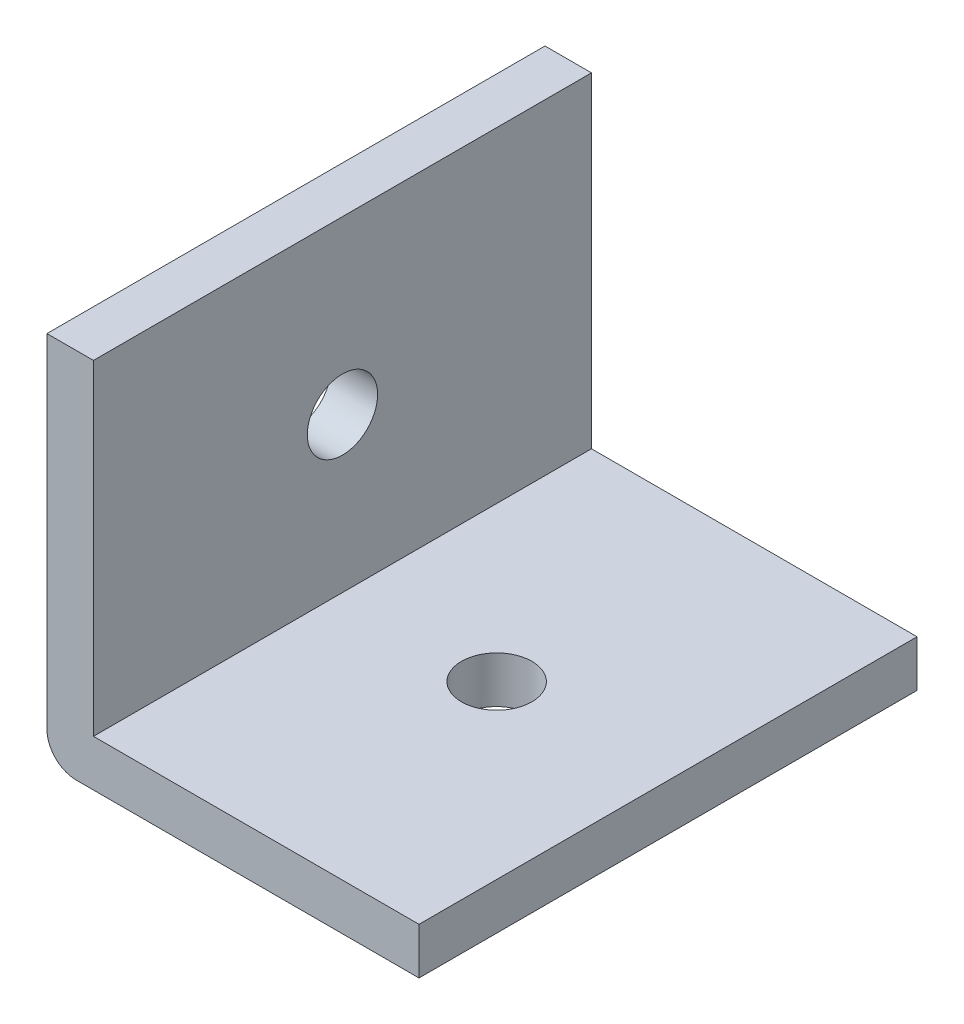
ISO-10303-21;
HEADER;
FILE_DESCRIPTION(('STEP AP214'),'2;1');
FILE_NAME('part.step','',(''),(''),'','','');
FILE_SCHEMA(('AUTOMOTIVE_DESIGN { 1 0 10303 214 1 1 1 1 }'));
ENDSEC;
DATA;
#1=APPLICATION_CONTEXT('core data for automotive mechanical design processes');
#2=APPLICATION_PROTOCOL_DEFINITION('international standard','automotive_design',2000,#1);
#3=PRODUCT_CONTEXT('',#1,'mechanical');
#4=PRODUCT('Part','Part','',(#3));
#5=PRODUCT_RELATED_PRODUCT_CATEGORY('part','',(#4));
#6=PRODUCT_DEFINITION_FORMATION('','',#4);
#7=PRODUCT_DEFINITION_CONTEXT('part definition',#1,'design');
#8=PRODUCT_DEFINITION('design','',#6,#7);
#9=PRODUCT_DEFINITION_SHAPE('','',#8);
#10=(LENGTH_UNIT() NAMED_UNIT(*) SI_UNIT(.MILLI.,.METRE.));
#11=(NAMED_UNIT(*) PLANE_ANGLE_UNIT() SI_UNIT($,.RADIAN.));
#12=(NAMED_UNIT(*) SI_UNIT($,.STERADIAN.) SOLID_ANGLE_UNIT());
#13=UNCERTAINTY_MEASURE_WITH_UNIT(LENGTH_MEASURE(1.E-05),#10,'distance_accuracy_value','');
#14=(GEOMETRIC_REPRESENTATION_CONTEXT(3) GLOBAL_UNCERTAINTY_ASSIGNED_CONTEXT((#13)) GLOBAL_UNIT_ASSIGNED_CONTEXT((#10,
#11,#12)) REPRESENTATION_CONTEXT('',''));
#15=CARTESIAN_POINT('',(0.,0.,0.));
#16=DIRECTION('',(0.,0.,1.));
#17=DIRECTION('',(1.,0.,0.));
#18=AXIS2_PLACEMENT_3D('',#15,#16,#17);
#19=CARTESIAN_POINT('',(0.,0.,0.));
#20=DIRECTION('',(0.,1.,0.));
#21=DIRECTION('',(0.,0.,1.));
#22=AXIS2_PLACEMENT_3D('',#19,#20,#21);
#23=PLANE('',#22);
#24=DIRECTION('',(1.,0.,0.));
#25=VECTOR('',#24,1.);
#26=CARTESIAN_POINT('',(0.,0.,17.));
#27=LINE('',#26,#25);
#28=CARTESIAN_POINT('',(1.,0.,17.));
#29=VERTEX_POINT('',#28);
#30=CARTESIAN_POINT('',(12.7,0.,17.));
#31=VERTEX_POINT('',#30);
#32=EDGE_CURVE('E130',#29,#31,#27,.T.);
#33=ORIENTED_EDGE('',*,*,#32,.F.);
#34=DIRECTION('',(0.,0.,1.));
#35=VECTOR('',#34,1.);
#36=CARTESIAN_POINT('',(1.,0.,0.));
#37=LINE('',#36,#35);
#38=CARTESIAN_POINT('',(1.,0.,0.));
#39=VERTEX_POINT('',#38);
#40=EDGE_CURVE('E42',#29,#39,#37,.F.);
#41=ORIENTED_EDGE('',*,*,#40,.T.);
#42=DIRECTION('',(-1.,0.,0.));
#43=VECTOR('',#42,1.);
#44=CARTESIAN_POINT('',(0.,0.,0.));
#45=LINE('',#44,#43);
#46=CARTESIAN_POINT('',(12.7,0.,0.));
#47=VERTEX_POINT('',#46);
#48=EDGE_CURVE('E134',#47,#39,#45,.T.);
#49=ORIENTED_EDGE('',*,*,#48,.F.);
#50=DIRECTION('',(0.,0.,-1.));
#51=VECTOR('',#50,1.);
#52=CARTESIAN_POINT('',(12.7,0.,0.));
#53=LINE('',#52,#51);
#54=EDGE_CURVE('E140',#31,#47,#53,.T.);
#55=ORIENTED_EDGE('',*,*,#54,.F.);
#56=EDGE_LOOP('',(#33,#41,#49,#55));
#57=FACE_BOUND('',#56,.T.);
#58=CARTESIAN_POINT('',(6.85,0.,8.5));
#59=DIRECTION('',(0.,-1.,0.));
#60=DIRECTION('',(0.,0.,-1.));
#61=AXIS2_PLACEMENT_3D('',#58,#59,#60);
#62=CIRCLE('',#61,1.2);
#63=CARTESIAN_POINT('',(6.85,0.,7.3));
#64=VERTEX_POINT('',#63);
#65=EDGE_CURVE('E252',#64,#64,#62,.T.);
#66=ORIENTED_EDGE('',*,*,#65,.F.);
#67=EDGE_LOOP('',(#66));
#68=FACE_BOUND('',#67,.T.);
#69=ADVANCED_FACE('F33',(#57,#68),#23,.F.);
#70=CARTESIAN_POINT('',(0.,1.5875,0.));
#71=DIRECTION('',(1.,0.,0.));
#72=DIRECTION('',(0.,0.,-1.));
#73=AXIS2_PLACEMENT_3D('',#70,#71,#72);
#74=PLANE('',#73);
#75=CARTESIAN_POINT('',(0.,6.85,8.5));
#76=DIRECTION('',(-1.,0.,0.));
#77=DIRECTION('',(0.,0.,1.));
#78=AXIS2_PLACEMENT_3D('',#75,#76,#77);
#79=CIRCLE('',#78,1.19999999999999);
#80=CARTESIAN_POINT('',(0.,6.85,9.69999999999999));
#81=VERTEX_POINT('',#80);
#82=EDGE_CURVE('E249',#81,#81,#79,.T.);
#83=ORIENTED_EDGE('',*,*,#82,.F.);
#84=EDGE_LOOP('',(#83));
#85=FACE_BOUND('',#84,.T.);
#86=DIRECTION('',(0.,-1.,0.));
#87=VECTOR('',#86,1.);
#88=CARTESIAN_POINT('',(0.,1.5875,0.));
#89=LINE('',#88,#87);
#90=CARTESIAN_POINT('',(0.,12.7,0.));
#91=VERTEX_POINT('',#90);
#92=CARTESIAN_POINT('',(0.,1.,0.));
#93=VERTEX_POINT('',#92);
#94=EDGE_CURVE('E138',#91,#93,#89,.T.);
#95=ORIENTED_EDGE('',*,*,#94,.T.);
#96=DIRECTION('',(0.,0.,1.));
#97=VECTOR('',#96,1.);
#98=CARTESIAN_POINT('',(0.,1.,0.));
#99=LINE('',#98,#97);
#100=CARTESIAN_POINT('',(0.,1.,17.));
#101=VERTEX_POINT('',#100);
#102=EDGE_CURVE('E99',#93,#101,#99,.T.);
#103=ORIENTED_EDGE('',*,*,#102,.T.);
#104=DIRECTION('',(0.,-1.,0.));
#105=VECTOR('',#104,1.);
#106=CARTESIAN_POINT('',(0.,1.5875,17.));
#107=LINE('',#106,#105);
#108=CARTESIAN_POINT('',(0.,12.7,17.));
#109=VERTEX_POINT('',#108);
#110=EDGE_CURVE('E92',#109,#101,#107,.T.);
#111=ORIENTED_EDGE('',*,*,#110,.F.);
#112=DIRECTION('',(0.,0.,1.));
#113=VECTOR('',#112,1.);
#114=CARTESIAN_POINT('',(0.,12.7,0.));
#115=LINE('',#114,#113);
#116=EDGE_CURVE('E97',#91,#109,#115,.T.);
#117=ORIENTED_EDGE('',*,*,#116,.F.);
#118=EDGE_LOOP('',(#95,#103,#111,#117));
#119=FACE_BOUND('',#118,.T.);
#120=ADVANCED_FACE('F95',(#85,#119),#74,.F.);
#121=CARTESIAN_POINT('',(0.,1.5875,17.));
#122=DIRECTION('',(0.,0.,-1.));
#123=DIRECTION('',(-1.,0.,0.));
#124=AXIS2_PLACEMENT_3D('',#121,#122,#123);
#125=PLANE('',#124);
#126=ORIENTED_EDGE('',*,*,#110,.T.);
#127=CARTESIAN_POINT('',(1.,1.,17.));
#128=DIRECTION('',(0.,0.,-1.));
#129=DIRECTION('',(-1.,0.,0.));
#130=AXIS2_PLACEMENT_3D('',#127,#128,#129);
#131=CIRCLE('',#130,1.);
#132=EDGE_CURVE('E56',#101,#29,#131,.F.);
#133=ORIENTED_EDGE('',*,*,#132,.T.);
#134=ORIENTED_EDGE('',*,*,#32,.T.);
#135=DIRECTION('',(0.,-1.,0.));
#136=VECTOR('',#135,1.);
#137=CARTESIAN_POINT('',(12.7,1.5875,17.));
#138=LINE('',#137,#136);
#139=CARTESIAN_POINT('',(12.7,1.5875,17.));
#140=VERTEX_POINT('',#139);
#141=EDGE_CURVE('E100',#140,#31,#138,.T.);
#142=ORIENTED_EDGE('',*,*,#141,.F.);
#143=DIRECTION('',(1.,0.,0.));
#144=VECTOR('',#143,1.);
#145=CARTESIAN_POINT('',(0.,1.5875,17.));
#146=LINE('',#145,#144);
#147=CARTESIAN_POINT('',(1.5875,1.5875,17.));
#148=VERTEX_POINT('',#147);
#149=EDGE_CURVE('E131',#148,#140,#146,.T.);
#150=ORIENTED_EDGE('',*,*,#149,.F.);
#151=DIRECTION('',(0.,-1.,0.));
#152=VECTOR('',#151,1.);
#153=CARTESIAN_POINT('',(1.5875,12.7,17.));
#154=LINE('',#153,#152);
#155=CARTESIAN_POINT('',(1.5875,12.7,17.));
#156=VERTEX_POINT('',#155);
#157=EDGE_CURVE('E107',#156,#148,#154,.T.);
#158=ORIENTED_EDGE('',*,*,#157,.F.);
#159=DIRECTION('',(1.,0.,0.));
#160=VECTOR('',#159,1.);
#161=CARTESIAN_POINT('',(0.,12.7,17.));
#162=LINE('',#161,#160);
#163=EDGE_CURVE('E103',#109,#156,#162,.T.);
#164=ORIENTED_EDGE('',*,*,#163,.F.);
#165=EDGE_LOOP('',(#126,#133,#134,#142,#150,#158,#164));
#166=FACE_BOUND('',#165,.T.);
#167=ADVANCED_FACE('F104',(#166),#125,.F.);
#168=CARTESIAN_POINT('',(12.7,1.5875,0.));
#169=DIRECTION('',(-1.,0.,0.));
#170=DIRECTION('',(0.,0.,1.));
#171=AXIS2_PLACEMENT_3D('',#168,#169,#170);
#172=PLANE('',#171);
#173=ORIENTED_EDGE('',*,*,#54,.T.);
#174=DIRECTION('',(0.,-1.,0.));
#175=VECTOR('',#174,1.);
#176=CARTESIAN_POINT('',(12.7,1.5875,0.));
#177=LINE('',#176,#175);
#178=CARTESIAN_POINT('',(12.7,1.5875,0.));
#179=VERTEX_POINT('',#178);
#180=EDGE_CURVE('E144',#179,#47,#177,.T.);
#181=ORIENTED_EDGE('',*,*,#180,.F.);
#182=DIRECTION('',(0.,0.,-1.));
#183=VECTOR('',#182,1.);
#184=CARTESIAN_POINT('',(12.7,1.5875,0.));
#185=LINE('',#184,#183);
#186=EDGE_CURVE('E133',#140,#179,#185,.T.);
#187=ORIENTED_EDGE('',*,*,#186,.F.);
#188=ORIENTED_EDGE('',*,*,#141,.T.);
#189=EDGE_LOOP('',(#173,#181,#187,#188));
#190=FACE_BOUND('',#189,.T.);
#191=ADVANCED_FACE('F155',(#190),#172,.F.);
#192=CARTESIAN_POINT('',(0.,1.5875,0.));
#193=DIRECTION('',(0.,0.,1.));
#194=DIRECTION('',(1.,0.,0.));
#195=AXIS2_PLACEMENT_3D('',#192,#193,#194);
#196=PLANE('',#195);
#197=ORIENTED_EDGE('',*,*,#48,.T.);
#198=CARTESIAN_POINT('',(1.,1.,0.));
#199=DIRECTION('',(0.,0.,1.));
#200=DIRECTION('',(1.,0.,0.));
#201=AXIS2_PLACEMENT_3D('',#198,#199,#200);
#202=CIRCLE('',#201,1.);
#203=EDGE_CURVE('E11',#39,#93,#202,.F.);
#204=ORIENTED_EDGE('',*,*,#203,.T.);
#205=ORIENTED_EDGE('',*,*,#94,.F.);
#206=DIRECTION('',(-1.,0.,0.));
#207=VECTOR('',#206,1.);
#208=CARTESIAN_POINT('',(0.,12.7,0.));
#209=LINE('',#208,#207);
#210=CARTESIAN_POINT('',(1.5875,12.7,0.));
#211=VERTEX_POINT('',#210);
#212=EDGE_CURVE('E115',#211,#91,#209,.T.);
#213=ORIENTED_EDGE('',*,*,#212,.F.);
#214=DIRECTION('',(0.,-1.,0.));
#215=VECTOR('',#214,1.);
#216=CARTESIAN_POINT('',(1.5875,12.7,0.));
#217=LINE('',#216,#215);
#218=CARTESIAN_POINT('',(1.5875,1.5875,0.));
#219=VERTEX_POINT('',#218);
#220=EDGE_CURVE('E125',#211,#219,#217,.T.);
#221=ORIENTED_EDGE('',*,*,#220,.T.);
#222=DIRECTION('',(-1.,0.,0.));
#223=VECTOR('',#222,1.);
#224=CARTESIAN_POINT('',(0.,1.5875,0.));
#225=LINE('',#224,#223);
#226=EDGE_CURVE('E136',#179,#219,#225,.T.);
#227=ORIENTED_EDGE('',*,*,#226,.F.);
#228=ORIENTED_EDGE('',*,*,#180,.T.);
#229=EDGE_LOOP('',(#197,#204,#205,#213,#221,#227,#228));
#230=FACE_BOUND('',#229,.T.);
#231=ADVANCED_FACE('F160',(#230),#196,.F.);
#232=CARTESIAN_POINT('',(0.,1.5875,0.));
#233=DIRECTION('',(0.,1.,0.));
#234=DIRECTION('',(0.,0.,1.));
#235=AXIS2_PLACEMENT_3D('',#232,#233,#234);
#236=PLANE('',#235);
#237=CARTESIAN_POINT('',(6.85,1.5875,8.5));
#238=DIRECTION('',(0.,1.,0.));
#239=DIRECTION('',(0.,0.,1.));
#240=AXIS2_PLACEMENT_3D('',#237,#238,#239);
#241=CIRCLE('',#240,1.2);
#242=CARTESIAN_POINT('',(6.85,1.5875,9.7));
#243=VERTEX_POINT('',#242);
#244=EDGE_CURVE('E119',#243,#243,#241,.T.);
#245=ORIENTED_EDGE('',*,*,#244,.F.);
#246=EDGE_LOOP('',(#245));
#247=FACE_BOUND('',#246,.T.);
#248=DIRECTION('',(0.,0.,-1.));
#249=VECTOR('',#248,1.);
#250=CARTESIAN_POINT('',(1.5875,1.5875,0.));
#251=LINE('',#250,#249);
#252=EDGE_CURVE('E116',#148,#219,#251,.T.);
#253=ORIENTED_EDGE('',*,*,#252,.F.);
#254=ORIENTED_EDGE('',*,*,#149,.T.);
#255=ORIENTED_EDGE('',*,*,#186,.T.);
#256=ORIENTED_EDGE('',*,*,#226,.T.);
#257=EDGE_LOOP('',(#253,#254,#255,#256));
#258=FACE_BOUND('',#257,.T.);
#259=ADVANCED_FACE('F182',(#247,#258),#236,.T.);
#260=CARTESIAN_POINT('',(1.5875,12.7,0.));
#261=DIRECTION('',(-1.,0.,0.));
#262=DIRECTION('',(0.,0.,1.));
#263=AXIS2_PLACEMENT_3D('',#260,#261,#262);
#264=PLANE('',#263);
#265=CARTESIAN_POINT('',(1.5875,6.85,8.5));
#266=DIRECTION('',(-1.,0.,0.));
#267=DIRECTION('',(0.,0.,1.));
#268=AXIS2_PLACEMENT_3D('',#265,#266,#267);
#269=CIRCLE('',#268,1.19999999999999);
#270=CARTESIAN_POINT('',(1.5875,6.85,9.69999999999999));
#271=VERTEX_POINT('',#270);
#272=EDGE_CURVE('E37',#271,#271,#269,.T.);
#273=ORIENTED_EDGE('',*,*,#272,.T.);
#274=EDGE_LOOP('',(#273));
#275=FACE_BOUND('',#274,.T.);
#276=ORIENTED_EDGE('',*,*,#252,.T.);
#277=ORIENTED_EDGE('',*,*,#220,.F.);
#278=DIRECTION('',(0.,0.,-1.));
#279=VECTOR('',#278,1.);
#280=CARTESIAN_POINT('',(1.5875,12.7,0.));
#281=LINE('',#280,#279);
#282=EDGE_CURVE('E110',#156,#211,#281,.T.);
#283=ORIENTED_EDGE('',*,*,#282,.F.);
#284=ORIENTED_EDGE('',*,*,#157,.T.);
#285=EDGE_LOOP('',(#276,#277,#283,#284));
#286=FACE_BOUND('',#285,.T.);
#287=ADVANCED_FACE('F172',(#275,#286),#264,.F.);
#288=CARTESIAN_POINT('',(0.,12.7,0.));
#289=DIRECTION('',(0.,1.,0.));
#290=DIRECTION('',(0.,0.,1.));
#291=AXIS2_PLACEMENT_3D('',#288,#289,#290);
#292=PLANE('',#291);
#293=ORIENTED_EDGE('',*,*,#116,.T.);
#294=ORIENTED_EDGE('',*,*,#163,.T.);
#295=ORIENTED_EDGE('',*,*,#282,.T.);
#296=ORIENTED_EDGE('',*,*,#212,.T.);
#297=EDGE_LOOP('',(#293,#294,#295,#296));
#298=FACE_BOUND('',#297,.T.);
#299=ADVANCED_FACE('F113',(#298),#292,.T.);
#300=CARTESIAN_POINT('',(1.,1.,0.));
#301=DIRECTION('',(0.,0.,1.));
#302=DIRECTION('',(1.,0.,0.));
#303=AXIS2_PLACEMENT_3D('',#300,#301,#302);
#304=CYLINDRICAL_SURFACE('',#303,1.);
#305=ORIENTED_EDGE('',*,*,#203,.F.);
#306=ORIENTED_EDGE('',*,*,#40,.F.);
#307=ORIENTED_EDGE('',*,*,#132,.F.);
#308=ORIENTED_EDGE('',*,*,#102,.F.);
#309=EDGE_LOOP('',(#305,#306,#307,#308));
#310=FACE_BOUND('',#309,.T.);
#311=ADVANCED_FACE('F35',(#310),#304,.T.);
#312=CARTESIAN_POINT('',(6.85,0.,8.5));
#313=DIRECTION('',(0.,-1.,0.));
#314=DIRECTION('',(0.,0.,-1.));
#315=AXIS2_PLACEMENT_3D('',#312,#313,#314);
#316=CYLINDRICAL_SURFACE('',#315,1.2);
#317=ORIENTED_EDGE('',*,*,#244,.T.);
#318=EDGE_LOOP('',(#317));
#319=FACE_BOUND('',#318,.T.);
#320=ORIENTED_EDGE('',*,*,#65,.T.);
#321=EDGE_LOOP('',(#320));
#322=FACE_BOUND('',#321,.T.);
#323=ADVANCED_FACE('F164',(#319,#322),#316,.F.);
#324=CARTESIAN_POINT('',(0.,6.85,8.5));
#325=DIRECTION('',(-1.,0.,0.));
#326=DIRECTION('',(0.,0.,1.));
#327=AXIS2_PLACEMENT_3D('',#324,#325,#326);
#328=CYLINDRICAL_SURFACE('',#327,1.19999999999999);
#329=ORIENTED_EDGE('',*,*,#82,.T.);
#330=EDGE_LOOP('',(#329));
#331=FACE_BOUND('',#330,.T.);
#332=ORIENTED_EDGE('',*,*,#272,.F.);
#333=EDGE_LOOP('',(#332));
#334=FACE_BOUND('',#333,.T.);
#335=ADVANCED_FACE('F169',(#331,#334),#328,.F.);
#336=CLOSED_SHELL('',(#69,#120,#167,#191,#231,#259,#287,#299,#311,#323,#335));
#337=MANIFOLD_SOLID_BREP('B2',#336);
#338=ADVANCED_BREP_SHAPE_REPRESENTATION('',(#18,#337),#14);
#339=SHAPE_DEFINITION_REPRESENTATION(#9,#338);
ENDSEC;
END-ISO-10303-21;
